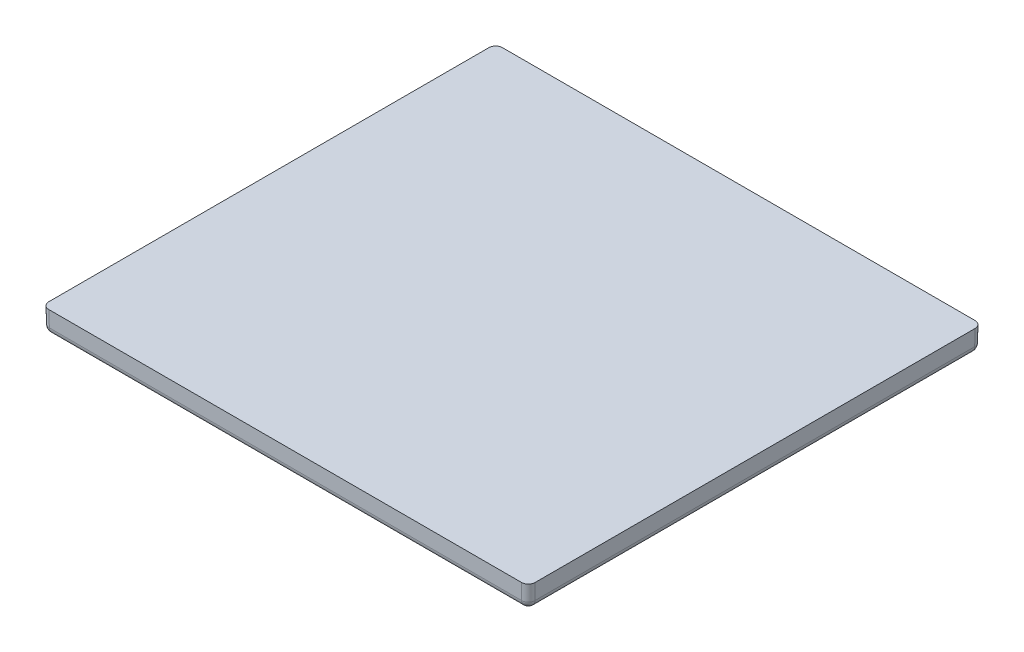
ISO-10303-21;
HEADER;
FILE_DESCRIPTION(('STEP AP214'),'2;1');
FILE_NAME('part.step','',(''),(''),'','','');
FILE_SCHEMA(('AUTOMOTIVE_DESIGN { 1 0 10303 214 1 1 1 1 }'));
ENDSEC;
DATA;
#1=APPLICATION_CONTEXT('core data for automotive mechanical design processes');
#2=APPLICATION_PROTOCOL_DEFINITION('international standard','automotive_design',2000,#1);
#3=PRODUCT_CONTEXT('',#1,'mechanical');
#4=PRODUCT('Part','Part','',(#3));
#5=PRODUCT_RELATED_PRODUCT_CATEGORY('part','',(#4));
#6=PRODUCT_DEFINITION_FORMATION('','',#4);
#7=PRODUCT_DEFINITION_CONTEXT('part definition',#1,'design');
#8=PRODUCT_DEFINITION('design','',#6,#7);
#9=PRODUCT_DEFINITION_SHAPE('','',#8);
#10=(LENGTH_UNIT() NAMED_UNIT(*) SI_UNIT(.MILLI.,.METRE.));
#11=(NAMED_UNIT(*) PLANE_ANGLE_UNIT() SI_UNIT($,.RADIAN.));
#12=(NAMED_UNIT(*) SI_UNIT($,.STERADIAN.) SOLID_ANGLE_UNIT());
#13=UNCERTAINTY_MEASURE_WITH_UNIT(LENGTH_MEASURE(1.E-05),#10,'distance_accuracy_value','');
#14=(GEOMETRIC_REPRESENTATION_CONTEXT(3) GLOBAL_UNCERTAINTY_ASSIGNED_CONTEXT((#13)) GLOBAL_UNIT_ASSIGNED_CONTEXT((#10,
#11,#12)) REPRESENTATION_CONTEXT('',''));
#15=CARTESIAN_POINT('',(0.,0.,0.));
#16=DIRECTION('',(0.,0.,1.));
#17=DIRECTION('',(1.,0.,0.));
#18=AXIS2_PLACEMENT_3D('',#15,#16,#17);
#19=CARTESIAN_POINT('',(107.75,0.,100.5));
#20=DIRECTION('',(0.999847695156391,-0.0174524064372835,0.));
#21=DIRECTION('',(0.0174524064372835,0.999847695156391,0.));
#22=AXIS2_PLACEMENT_3D('',#19,#20,#21);
#23=PLANE('',#22);
#24=DIRECTION('',(0.,0.,-1.));
#25=VECTOR('',#24,1.);
#26=CARTESIAN_POINT('',(107.801451296122,2.94764278068815,-100.5));
#27=LINE('',#26,#25);
#28=CARTESIAN_POINT('',(107.801451296122,2.94764278068815,97.551908210653));
#29=VERTEX_POINT('',#28);
#30=CARTESIAN_POINT('',(107.801451296122,2.94764278068815,-97.5519082106529));
#31=VERTEX_POINT('',#30);
#32=EDGE_CURVE('E170',#29,#31,#27,.T.);
#33=ORIENTED_EDGE('',*,*,#32,.T.);
#34=DIRECTION('',(0.0174497491606827,0.999695459881888,-0.0174497491606827));
#35=VECTOR('',#34,1.);
#36=CARTESIAN_POINT('',(107.68971009921,-3.45400610299427,-97.4401670137406));
#37=LINE('',#36,#35);
#38=CARTESIAN_POINT('',(107.924550649282,10.,-97.675007563813));
#39=VERTEX_POINT('',#38);
#40=EDGE_CURVE('E172',#31,#39,#37,.T.);
#41=ORIENTED_EDGE('',*,*,#40,.T.);
#42=DIRECTION('',(0.,0.,1.));
#43=VECTOR('',#42,1.);
#44=CARTESIAN_POINT('',(107.924550649282,10.,0.));
#45=LINE('',#44,#43);
#46=CARTESIAN_POINT('',(107.924550649282,10.,97.675007563813));
#47=VERTEX_POINT('',#46);
#48=EDGE_CURVE('E120',#47,#39,#45,.F.);
#49=ORIENTED_EDGE('',*,*,#48,.F.);
#50=DIRECTION('',(0.0174497491606827,0.999695459881888,0.0174497491606827));
#51=VECTOR('',#50,1.);
#52=CARTESIAN_POINT('',(107.75091334211,0.0523253344201977,97.5013702566405));
#53=LINE('',#52,#51);
#54=EDGE_CURVE('E168',#47,#29,#53,.F.);
#55=ORIENTED_EDGE('',*,*,#54,.T.);
#56=EDGE_LOOP('',(#33,#41,#49,#55));
#57=FACE_BOUND('',#56,.T.);
#58=ADVANCED_FACE('F37',(#57),#23,.T.);
#59=CARTESIAN_POINT('',(-107.75,0.,-100.5));
#60=DIRECTION('',(0.,-0.0174524064372835,-0.999847695156391));
#61=DIRECTION('',(0.,0.999847695156391,-0.0174524064372835));
#62=AXIS2_PLACEMENT_3D('',#59,#60,#61);
#63=PLANE('',#62);
#64=DIRECTION('',(-1.,0.,0.));
#65=VECTOR('',#64,1.);
#66=CARTESIAN_POINT('',(-107.75,2.94764278068815,-100.551451296122));
#67=LINE('',#66,#65);
#68=CARTESIAN_POINT('',(104.801908210653,2.94764278068815,-100.551451296122));
#69=VERTEX_POINT('',#68);
#70=CARTESIAN_POINT('',(-104.801908210653,2.94764278068815,-100.551451296122));
#71=VERTEX_POINT('',#70);
#72=EDGE_CURVE('E140',#69,#71,#67,.T.);
#73=ORIENTED_EDGE('',*,*,#72,.T.);
#74=DIRECTION('',(-0.0174497491606827,0.999695459881888,-0.0174497491606827));
#75=VECTOR('',#74,1.);
#76=CARTESIAN_POINT('',(-104.751370256641,0.0523253344201977,-100.50091334211));
#77=LINE('',#76,#75);
#78=CARTESIAN_POINT('',(-104.925007563813,10.,-100.674550649282));
#79=VERTEX_POINT('',#78);
#80=EDGE_CURVE('E133',#71,#79,#77,.T.);
#81=ORIENTED_EDGE('',*,*,#80,.T.);
#82=DIRECTION('',(1.,0.,0.));
#83=VECTOR('',#82,1.);
#84=CARTESIAN_POINT('',(0.,10.,-100.674550649282));
#85=LINE('',#84,#83);
#86=CARTESIAN_POINT('',(104.925007563813,10.,-100.674550649282));
#87=VERTEX_POINT('',#86);
#88=EDGE_CURVE('E117',#87,#79,#85,.F.);
#89=ORIENTED_EDGE('',*,*,#88,.F.);
#90=DIRECTION('',(0.0174497491606827,0.999695459881888,-0.0174497491606827));
#91=VECTOR('',#90,1.);
#92=CARTESIAN_POINT('',(104.685751854427,-3.70695041066845,-100.435294939896));
#93=LINE('',#92,#91);
#94=EDGE_CURVE('E130',#87,#69,#93,.F.);
#95=ORIENTED_EDGE('',*,*,#94,.T.);
#96=EDGE_LOOP('',(#73,#81,#89,#95));
#97=FACE_BOUND('',#96,.T.);
#98=ADVANCED_FACE('F129',(#97),#63,.T.);
#99=CARTESIAN_POINT('',(-107.75,0.,100.5));
#100=DIRECTION('',(-0.999847695156391,-0.0174524064372835,0.));
#101=DIRECTION('',(0.0174524064372835,-0.999847695156391,0.));
#102=AXIS2_PLACEMENT_3D('',#99,#100,#101);
#103=PLANE('',#102);
#104=DIRECTION('',(0.,0.,-1.));
#105=VECTOR('',#104,1.);
#106=CARTESIAN_POINT('',(-107.924550649282,10.,0.));
#107=LINE('',#106,#105);
#108=CARTESIAN_POINT('',(-107.924550649282,10.,-97.675007563813));
#109=VERTEX_POINT('',#108);
#110=CARTESIAN_POINT('',(-107.924550649282,10.,97.675007563813));
#111=VERTEX_POINT('',#110);
#112=EDGE_CURVE('E134',#109,#111,#107,.F.);
#113=ORIENTED_EDGE('',*,*,#112,.F.);
#114=DIRECTION('',(-0.0174497491606827,0.999695459881888,-0.0174497491606827));
#115=VECTOR('',#114,1.);
#116=CARTESIAN_POINT('',(-107.68971009921,-3.45400610299427,-97.4401670137405));
#117=LINE('',#116,#115);
#118=CARTESIAN_POINT('',(-107.801451296122,2.94764278068815,-97.5519082106529));
#119=VERTEX_POINT('',#118);
#120=EDGE_CURVE('E162',#109,#119,#117,.F.);
#121=ORIENTED_EDGE('',*,*,#120,.T.);
#122=DIRECTION('',(0.,0.,1.));
#123=VECTOR('',#122,1.);
#124=CARTESIAN_POINT('',(-107.801451296122,2.94764278068815,100.5));
#125=LINE('',#124,#123);
#126=CARTESIAN_POINT('',(-107.801451296122,2.94764278068815,97.551908210653));
#127=VERTEX_POINT('',#126);
#128=EDGE_CURVE('E160',#119,#127,#125,.T.);
#129=ORIENTED_EDGE('',*,*,#128,.T.);
#130=DIRECTION('',(-0.0174497491606827,0.999695459881888,0.0174497491606827));
#131=VECTOR('',#130,1.);
#132=CARTESIAN_POINT('',(-107.75091334211,0.0523253344201977,97.5013702566405));
#133=LINE('',#132,#131);
#134=EDGE_CURVE('E158',#127,#111,#133,.T.);
#135=ORIENTED_EDGE('',*,*,#134,.T.);
#136=EDGE_LOOP('',(#113,#121,#129,#135));
#137=FACE_BOUND('',#136,.T.);
#138=ADVANCED_FACE('F250',(#137),#103,.T.);
#139=CARTESIAN_POINT('',(-107.75,0.,100.5));
#140=DIRECTION('',(0.,-0.0174524064372835,0.999847695156391));
#141=DIRECTION('',(0.,-0.999847695156391,-0.0174524064372835));
#142=AXIS2_PLACEMENT_3D('',#139,#140,#141);
#143=PLANE('',#142);
#144=DIRECTION('',(1.,0.,0.));
#145=VECTOR('',#144,1.);
#146=CARTESIAN_POINT('',(107.75,2.94764278068815,100.551451296122));
#147=LINE('',#146,#145);
#148=CARTESIAN_POINT('',(-104.801908210653,2.94764278068815,100.551451296122));
#149=VERTEX_POINT('',#148);
#150=CARTESIAN_POINT('',(104.801908210653,2.94764278068815,100.551451296122));
#151=VERTEX_POINT('',#150);
#152=EDGE_CURVE('E46',#149,#151,#147,.T.);
#153=ORIENTED_EDGE('',*,*,#152,.T.);
#154=DIRECTION('',(0.0174497491606827,0.999695459881888,0.0174497491606827));
#155=VECTOR('',#154,1.);
#156=CARTESIAN_POINT('',(104.685751854427,-3.70695041066845,100.435294939896));
#157=LINE('',#156,#155);
#158=CARTESIAN_POINT('',(104.925007563813,10.,100.674550649282));
#159=VERTEX_POINT('',#158);
#160=EDGE_CURVE('E11',#151,#159,#157,.T.);
#161=ORIENTED_EDGE('',*,*,#160,.T.);
#162=DIRECTION('',(-1.,0.,0.));
#163=VECTOR('',#162,1.);
#164=CARTESIAN_POINT('',(0.,10.,100.674550649282));
#165=LINE('',#164,#163);
#166=CARTESIAN_POINT('',(-104.925007563813,10.,100.674550649282));
#167=VERTEX_POINT('',#166);
#168=EDGE_CURVE('E141',#167,#159,#165,.F.);
#169=ORIENTED_EDGE('',*,*,#168,.F.);
#170=DIRECTION('',(-0.0174497491606827,0.999695459881888,0.0174497491606827));
#171=VECTOR('',#170,1.);
#172=CARTESIAN_POINT('',(-104.751370256641,0.0523253344201977,100.50091334211));
#173=LINE('',#172,#171);
#174=EDGE_CURVE('E57',#167,#149,#173,.F.);
#175=ORIENTED_EDGE('',*,*,#174,.T.);
#176=EDGE_LOOP('',(#153,#161,#169,#175));
#177=FACE_BOUND('',#176,.T.);
#178=ADVANCED_FACE('F255',(#177),#143,.T.);
#179=CARTESIAN_POINT('',(0.,10.,0.));
#180=DIRECTION('',(0.,-1.,0.));
#181=DIRECTION('',(0.,0.,-1.));
#182=AXIS2_PLACEMENT_3D('',#179,#180,#181);
#183=PLANE('',#182);
#184=ORIENTED_EDGE('',*,*,#88,.T.);
#185=CARTESIAN_POINT('',(-104.92409366515,10.,-97.6740936651504));
#186=DIRECTION('',(0.,-1.,0.));
#187=DIRECTION('',(0.707106781186548,0.,0.707106781186548));
#188=AXIS2_PLACEMENT_3D('',#185,#186,#187);
#189=ELLIPSE('',#188,3.00091389867315,3.);
#190=EDGE_CURVE('E124',#79,#109,#189,.F.);
#191=ORIENTED_EDGE('',*,*,#190,.T.);
#192=ORIENTED_EDGE('',*,*,#112,.T.);
#193=CARTESIAN_POINT('',(-104.92409366515,10.,97.6740936651505));
#194=DIRECTION('',(0.,-1.,0.));
#195=DIRECTION('',(0.707106781186548,0.,-0.707106781186548));
#196=AXIS2_PLACEMENT_3D('',#193,#194,#195);
#197=ELLIPSE('',#196,3.00091389867315,3.);
#198=EDGE_CURVE('E164',#111,#167,#197,.F.);
#199=ORIENTED_EDGE('',*,*,#198,.T.);
#200=ORIENTED_EDGE('',*,*,#168,.T.);
#201=CARTESIAN_POINT('',(104.92409366515,10.,97.6740936651505));
#202=DIRECTION('',(0.,-1.,0.));
#203=DIRECTION('',(-0.707106781186548,0.,-0.707106781186548));
#204=AXIS2_PLACEMENT_3D('',#201,#202,#203);
#205=ELLIPSE('',#204,3.00091389867315,3.);
#206=EDGE_CURVE('E125',#159,#47,#205,.F.);
#207=ORIENTED_EDGE('',*,*,#206,.T.);
#208=ORIENTED_EDGE('',*,*,#48,.T.);
#209=CARTESIAN_POINT('',(104.92409366515,10.,-97.6740936651505));
#210=DIRECTION('',(0.,-1.,0.));
#211=DIRECTION('',(-0.707106781186548,0.,0.707106781186548));
#212=AXIS2_PLACEMENT_3D('',#209,#210,#211);
#213=ELLIPSE('',#212,3.00091389867315,3.);
#214=EDGE_CURVE('E114',#39,#87,#213,.F.);
#215=ORIENTED_EDGE('',*,*,#214,.T.);
#216=EDGE_LOOP('',(#184,#191,#192,#199,#200,#207,#208,#215));
#217=FACE_BOUND('',#216,.T.);
#218=ADVANCED_FACE('F116',(#217),#183,.F.);
#219=CARTESIAN_POINT('',(0.,0.,0.));
#220=DIRECTION('',(0.,-1.,0.));
#221=DIRECTION('',(0.,0.,-1.));
#222=AXIS2_PLACEMENT_3D('',#219,#220,#221);
#223=PLANE('',#222);
#224=DIRECTION('',(0.,0.,-1.));
#225=VECTOR('',#224,1.);
#226=CARTESIAN_POINT('',(-104.801908210653,0.,-100.5));
#227=LINE('',#226,#225);
#228=CARTESIAN_POINT('',(-104.801908210653,0.,97.551908210653));
#229=VERTEX_POINT('',#228);
#230=CARTESIAN_POINT('',(-104.801908210653,0.,-97.5519082106529));
#231=VERTEX_POINT('',#230);
#232=EDGE_CURVE('E151',#229,#231,#227,.T.);
#233=ORIENTED_EDGE('',*,*,#232,.T.);
#234=DIRECTION('',(1.,0.,0.));
#235=VECTOR('',#234,1.);
#236=CARTESIAN_POINT('',(107.75,0.,-97.5519082106529));
#237=LINE('',#236,#235);
#238=CARTESIAN_POINT('',(104.801908210653,0.,-97.5519082106529));
#239=VERTEX_POINT('',#238);
#240=EDGE_CURVE('E155',#231,#239,#237,.T.);
#241=ORIENTED_EDGE('',*,*,#240,.T.);
#242=DIRECTION('',(0.,0.,1.));
#243=VECTOR('',#242,1.);
#244=CARTESIAN_POINT('',(104.801908210653,0.,100.5));
#245=LINE('',#244,#243);
#246=CARTESIAN_POINT('',(104.801908210653,0.,97.551908210653));
#247=VERTEX_POINT('',#246);
#248=EDGE_CURVE('E153',#239,#247,#245,.T.);
#249=ORIENTED_EDGE('',*,*,#248,.T.);
#250=DIRECTION('',(-1.,0.,0.));
#251=VECTOR('',#250,1.);
#252=CARTESIAN_POINT('',(-107.75,0.,97.551908210653));
#253=LINE('',#252,#251);
#254=EDGE_CURVE('E149',#247,#229,#253,.T.);
#255=ORIENTED_EDGE('',*,*,#254,.T.);
#256=EDGE_LOOP('',(#233,#241,#249,#255));
#257=FACE_BOUND('',#256,.T.);
#258=ADVANCED_FACE('F227',(#257),#223,.T.);
#259=CARTESIAN_POINT('',(104.75137025664,0.104682553732048,97.5013702566405));
#260=DIRECTION('',(-0.0174497491606827,-0.999695459881887,-0.0174497491606827));
#261=DIRECTION('',(0.,0.0174524064372835,-0.999847695156391));
#262=AXIS2_PLACEMENT_3D('',#259,#260,#261);
#263=CYLINDRICAL_SURFACE('',#262,3.);
#264=ORIENTED_EDGE('',*,*,#206,.F.);
#265=ORIENTED_EDGE('',*,*,#160,.F.);
#266=CARTESIAN_POINT('',(104.801908210653,3.,97.551908210653));
#267=DIRECTION('',(-0.0174497491606828,-0.999695459881888,-0.0174497491606828));
#268=DIRECTION('',(0.,0.0174524064372836,-0.999847695156391));
#269=AXIS2_PLACEMENT_3D('',#266,#267,#268);
#270=CIRCLE('',#269,3.);
#271=EDGE_CURVE('E201',#29,#151,#270,.T.);
#272=ORIENTED_EDGE('',*,*,#271,.F.);
#273=ORIENTED_EDGE('',*,*,#54,.F.);
#274=EDGE_LOOP('',(#264,#265,#272,#273));
#275=FACE_BOUND('',#274,.T.);
#276=ADVANCED_FACE('F39',(#275),#263,.T.);
#277=CARTESIAN_POINT('',(-104.751370256641,0.104682553732048,97.5013702566405));
#278=DIRECTION('',(0.0174497491606827,-0.999695459881887,-0.0174497491606827));
#279=DIRECTION('',(0.,0.0174524064372835,-0.999847695156391));
#280=AXIS2_PLACEMENT_3D('',#277,#278,#279);
#281=CYLINDRICAL_SURFACE('',#280,3.);
#282=ORIENTED_EDGE('',*,*,#198,.F.);
#283=ORIENTED_EDGE('',*,*,#134,.F.);
#284=CARTESIAN_POINT('',(-104.801908210653,3.,97.551908210653));
#285=DIRECTION('',(0.0174497491606828,-0.999695459881888,-0.0174497491606828));
#286=DIRECTION('',(0.,0.0174524064372836,-0.999847695156391));
#287=AXIS2_PLACEMENT_3D('',#284,#285,#286);
#288=CIRCLE('',#287,3.);
#289=EDGE_CURVE('E199',#149,#127,#288,.T.);
#290=ORIENTED_EDGE('',*,*,#289,.F.);
#291=ORIENTED_EDGE('',*,*,#174,.F.);
#292=EDGE_LOOP('',(#282,#283,#290,#291));
#293=FACE_BOUND('',#292,.T.);
#294=ADVANCED_FACE('F216',(#293),#281,.T.);
#295=CARTESIAN_POINT('',(-107.75,3.,97.551908210653));
#296=DIRECTION('',(1.,0.,0.));
#297=DIRECTION('',(0.,0.,-1.));
#298=AXIS2_PLACEMENT_3D('',#295,#296,#297);
#299=CYLINDRICAL_SURFACE('',#298,3.);
#300=CARTESIAN_POINT('',(104.801908210653,3.,97.551908210653));
#301=DIRECTION('',(1.,0.,0.));
#302=DIRECTION('',(0.,0.,-1.));
#303=AXIS2_PLACEMENT_3D('',#300,#301,#302);
#304=CIRCLE('',#303,3.);
#305=EDGE_CURVE('E41',#151,#247,#304,.T.);
#306=ORIENTED_EDGE('',*,*,#305,.F.);
#307=ORIENTED_EDGE('',*,*,#152,.F.);
#308=CARTESIAN_POINT('',(-104.801908210653,3.,97.551908210653));
#309=DIRECTION('',(-1.,0.,0.));
#310=DIRECTION('',(0.,0.,1.));
#311=AXIS2_PLACEMENT_3D('',#308,#309,#310);
#312=CIRCLE('',#311,3.);
#313=EDGE_CURVE('E196',#229,#149,#312,.T.);
#314=ORIENTED_EDGE('',*,*,#313,.F.);
#315=ORIENTED_EDGE('',*,*,#254,.F.);
#316=EDGE_LOOP('',(#306,#307,#314,#315));
#317=FACE_BOUND('',#316,.T.);
#318=ADVANCED_FACE('F225',(#317),#299,.T.);
#319=CARTESIAN_POINT('',(104.801908210653,3.,97.551908210653));
#320=DIRECTION('',(0.,-1.,0.));
#321=DIRECTION('',(0.,0.,-1.));
#322=AXIS2_PLACEMENT_3D('',#319,#320,#321);
#323=SPHERICAL_SURFACE('',#322,3.);
#324=ORIENTED_EDGE('',*,*,#271,.T.);
#325=ORIENTED_EDGE('',*,*,#305,.T.);
#326=CARTESIAN_POINT('',(104.801908210653,3.,97.551908210653));
#327=DIRECTION('',(0.,0.,1.));
#328=DIRECTION('',(1.,0.,0.));
#329=AXIS2_PLACEMENT_3D('',#326,#327,#328);
#330=CIRCLE('',#329,3.);
#331=EDGE_CURVE('E193',#29,#247,#330,.F.);
#332=ORIENTED_EDGE('',*,*,#331,.F.);
#333=EDGE_LOOP('',(#324,#325,#332));
#334=FACE_BOUND('',#333,.T.);
#335=ADVANCED_FACE('F235',(#334),#323,.T.);
#336=CARTESIAN_POINT('',(-104.801908210653,3.,97.551908210653));
#337=DIRECTION('',(0.,-1.,0.));
#338=DIRECTION('',(0.,0.,-1.));
#339=AXIS2_PLACEMENT_3D('',#336,#337,#338);
#340=SPHERICAL_SURFACE('',#339,3.);
#341=ORIENTED_EDGE('',*,*,#313,.T.);
#342=ORIENTED_EDGE('',*,*,#289,.T.);
#343=CARTESIAN_POINT('',(-104.801908210653,3.,97.551908210653));
#344=DIRECTION('',(0.,0.,1.));
#345=DIRECTION('',(1.,0.,0.));
#346=AXIS2_PLACEMENT_3D('',#343,#344,#345);
#347=CIRCLE('',#346,3.);
#348=EDGE_CURVE('E190',#229,#127,#347,.F.);
#349=ORIENTED_EDGE('',*,*,#348,.F.);
#350=EDGE_LOOP('',(#341,#342,#349));
#351=FACE_BOUND('',#350,.T.);
#352=ADVANCED_FACE('F221',(#351),#340,.T.);
#353=CARTESIAN_POINT('',(104.801908210653,3.,100.5));
#354=DIRECTION('',(0.,0.,-1.));
#355=DIRECTION('',(-1.,0.,0.));
#356=AXIS2_PLACEMENT_3D('',#353,#354,#355);
#357=CYLINDRICAL_SURFACE('',#356,3.);
#358=ORIENTED_EDGE('',*,*,#331,.T.);
#359=ORIENTED_EDGE('',*,*,#248,.F.);
#360=CARTESIAN_POINT('',(104.801908210653,3.,-97.5519082106529));
#361=DIRECTION('',(0.,0.,-1.));
#362=DIRECTION('',(-1.,0.,0.));
#363=AXIS2_PLACEMENT_3D('',#360,#361,#362);
#364=CIRCLE('',#363,3.);
#365=EDGE_CURVE('E187',#31,#239,#364,.T.);
#366=ORIENTED_EDGE('',*,*,#365,.F.);
#367=ORIENTED_EDGE('',*,*,#32,.F.);
#368=EDGE_LOOP('',(#358,#359,#366,#367));
#369=FACE_BOUND('',#368,.T.);
#370=ADVANCED_FACE('F233',(#369),#357,.T.);
#371=CARTESIAN_POINT('',(104.685751854427,-3.6545931913566,-97.4357518544269));
#372=DIRECTION('',(-0.0174497491606827,-0.999695459881887,0.0174497491606827));
#373=DIRECTION('',(0.,-0.0174524064372835,-0.999847695156391));
#374=AXIS2_PLACEMENT_3D('',#371,#372,#373);
#375=CYLINDRICAL_SURFACE('',#374,3.);
#376=ORIENTED_EDGE('',*,*,#214,.F.);
#377=ORIENTED_EDGE('',*,*,#40,.F.);
#378=CARTESIAN_POINT('',(104.801908210653,3.,-97.5519082106529));
#379=DIRECTION('',(-0.0174497491606829,-0.999695459881888,0.0174497491606828));
#380=DIRECTION('',(0.999847695156391,-0.0174524064372838,0.));
#381=AXIS2_PLACEMENT_3D('',#378,#379,#380);
#382=CIRCLE('',#381,3.);
#383=EDGE_CURVE('E138',#69,#31,#382,.T.);
#384=ORIENTED_EDGE('',*,*,#383,.F.);
#385=ORIENTED_EDGE('',*,*,#94,.F.);
#386=EDGE_LOOP('',(#376,#377,#384,#385));
#387=FACE_BOUND('',#386,.T.);
#388=ADVANCED_FACE('F136',(#387),#375,.T.);
#389=CARTESIAN_POINT('',(-104.690167013741,-3.40164888368242,-97.4401670137406));
#390=DIRECTION('',(0.0174497491606827,-0.999695459881887,0.0174497491606827));
#391=DIRECTION('',(0.,-0.0174524064372835,-0.999847695156391));
#392=AXIS2_PLACEMENT_3D('',#389,#390,#391);
#393=CYLINDRICAL_SURFACE('',#392,3.);
#394=ORIENTED_EDGE('',*,*,#190,.F.);
#395=ORIENTED_EDGE('',*,*,#80,.F.);
#396=CARTESIAN_POINT('',(-104.801908210653,3.,-97.5519082106529));
#397=DIRECTION('',(0.0174497491606828,-0.999695459881887,0.0174497491606826));
#398=DIRECTION('',(0.999847695156391,0.0174524064372836,0.));
#399=AXIS2_PLACEMENT_3D('',#396,#397,#398);
#400=CIRCLE('',#399,3.);
#401=EDGE_CURVE('E183',#119,#71,#400,.T.);
#402=ORIENTED_EDGE('',*,*,#401,.F.);
#403=ORIENTED_EDGE('',*,*,#120,.F.);
#404=EDGE_LOOP('',(#394,#395,#402,#403));
#405=FACE_BOUND('',#404,.T.);
#406=ADVANCED_FACE('F275',(#405),#393,.T.);
#407=CARTESIAN_POINT('',(-104.801908210653,3.,100.5));
#408=DIRECTION('',(0.,0.,1.));
#409=DIRECTION('',(1.,0.,0.));
#410=AXIS2_PLACEMENT_3D('',#407,#408,#409);
#411=CYLINDRICAL_SURFACE('',#410,3.);
#412=ORIENTED_EDGE('',*,*,#348,.T.);
#413=ORIENTED_EDGE('',*,*,#128,.F.);
#414=CARTESIAN_POINT('',(-104.801908210653,3.,-97.5519082106529));
#415=DIRECTION('',(0.,0.,-1.));
#416=DIRECTION('',(-1.,0.,0.));
#417=AXIS2_PLACEMENT_3D('',#414,#415,#416);
#418=CIRCLE('',#417,3.);
#419=EDGE_CURVE('E180',#231,#119,#418,.T.);
#420=ORIENTED_EDGE('',*,*,#419,.F.);
#421=ORIENTED_EDGE('',*,*,#232,.F.);
#422=EDGE_LOOP('',(#412,#413,#420,#421));
#423=FACE_BOUND('',#422,.T.);
#424=ADVANCED_FACE('F271',(#423),#411,.T.);
#425=CARTESIAN_POINT('',(104.801908210653,3.,-97.5519082106529));
#426=DIRECTION('',(0.,-1.,0.));
#427=DIRECTION('',(0.,0.,-1.));
#428=AXIS2_PLACEMENT_3D('',#425,#426,#427);
#429=SPHERICAL_SURFACE('',#428,3.);
#430=ORIENTED_EDGE('',*,*,#383,.T.);
#431=ORIENTED_EDGE('',*,*,#365,.T.);
#432=CARTESIAN_POINT('',(104.801908210653,3.,-97.5519082106529));
#433=DIRECTION('',(1.,0.,0.));
#434=DIRECTION('',(0.,0.,-1.));
#435=AXIS2_PLACEMENT_3D('',#432,#433,#434);
#436=CIRCLE('',#435,3.);
#437=EDGE_CURVE('E178',#69,#239,#436,.F.);
#438=ORIENTED_EDGE('',*,*,#437,.F.);
#439=EDGE_LOOP('',(#430,#431,#438));
#440=FACE_BOUND('',#439,.T.);
#441=ADVANCED_FACE('F267',(#440),#429,.T.);
#442=CARTESIAN_POINT('',(-104.801908210653,3.,-97.5519082106529));
#443=DIRECTION('',(0.,-1.,0.));
#444=DIRECTION('',(0.,0.,-1.));
#445=AXIS2_PLACEMENT_3D('',#442,#443,#444);
#446=SPHERICAL_SURFACE('',#445,3.);
#447=ORIENTED_EDGE('',*,*,#419,.T.);
#448=ORIENTED_EDGE('',*,*,#401,.T.);
#449=CARTESIAN_POINT('',(-104.801908210653,3.,-97.5519082106529));
#450=DIRECTION('',(-1.,0.,0.));
#451=DIRECTION('',(0.,0.,1.));
#452=AXIS2_PLACEMENT_3D('',#449,#450,#451);
#453=CIRCLE('',#452,3.);
#454=EDGE_CURVE('E176',#231,#71,#453,.F.);
#455=ORIENTED_EDGE('',*,*,#454,.F.);
#456=EDGE_LOOP('',(#447,#448,#455));
#457=FACE_BOUND('',#456,.T.);
#458=ADVANCED_FACE('F263',(#457),#446,.T.);
#459=CARTESIAN_POINT('',(-107.75,3.,-97.5519082106529));
#460=DIRECTION('',(-1.,0.,0.));
#461=DIRECTION('',(0.,0.,1.));
#462=AXIS2_PLACEMENT_3D('',#459,#460,#461);
#463=CYLINDRICAL_SURFACE('',#462,3.);
#464=ORIENTED_EDGE('',*,*,#437,.T.);
#465=ORIENTED_EDGE('',*,*,#240,.F.);
#466=ORIENTED_EDGE('',*,*,#454,.T.);
#467=ORIENTED_EDGE('',*,*,#72,.F.);
#468=EDGE_LOOP('',(#464,#465,#466,#467));
#469=FACE_BOUND('',#468,.T.);
#470=ADVANCED_FACE('F260',(#469),#463,.T.);
#471=CLOSED_SHELL('',(#58,#98,#138,#178,#218,#258,#276,#294,#318,#335,#352,#370,#388,#406,#424,
#441,#458,#470));
#472=MANIFOLD_SOLID_BREP('B2',#471);
#473=ADVANCED_BREP_SHAPE_REPRESENTATION('',(#18,#472),#14);
#474=SHAPE_DEFINITION_REPRESENTATION(#9,#473);
ENDSEC;
END-ISO-10303-21;
